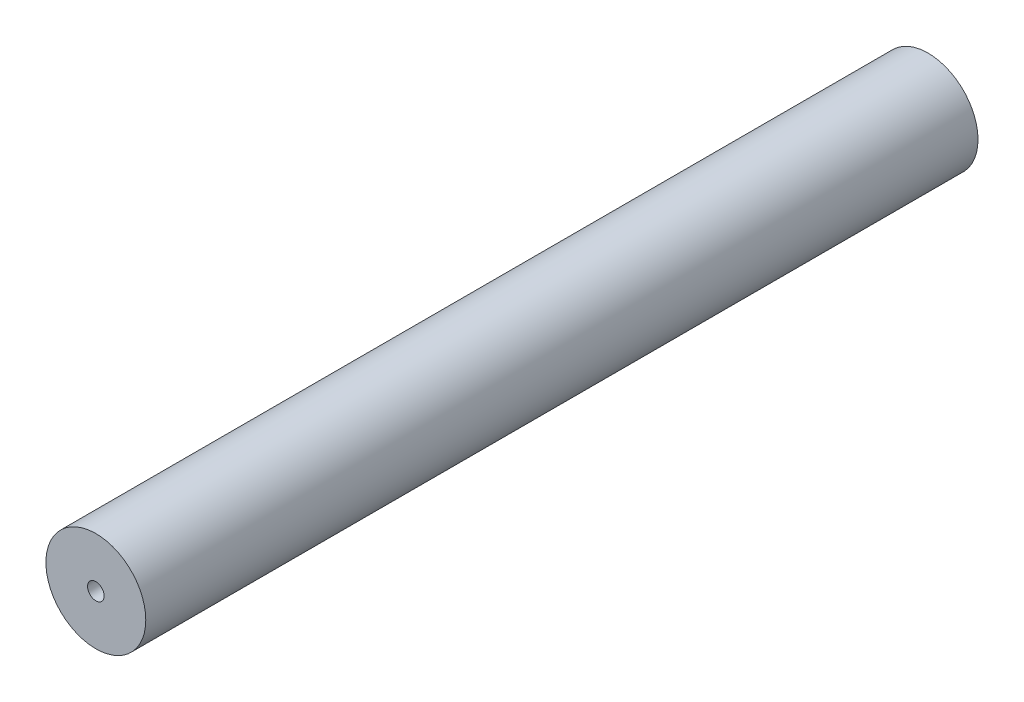
ISO-10303-21;
HEADER;
FILE_DESCRIPTION(('STEP AP214'),'2;1');
FILE_NAME('part.step','',(''),(''),'','','');
FILE_SCHEMA(('AUTOMOTIVE_DESIGN { 1 0 10303 214 1 1 1 1 }'));
ENDSEC;
DATA;
#1=APPLICATION_CONTEXT('core data for automotive mechanical design processes');
#2=APPLICATION_PROTOCOL_DEFINITION('international standard','automotive_design',2000,#1);
#3=PRODUCT_CONTEXT('',#1,'mechanical');
#4=PRODUCT('Part','Part','',(#3));
#5=PRODUCT_RELATED_PRODUCT_CATEGORY('part','',(#4));
#6=PRODUCT_DEFINITION_FORMATION('','',#4);
#7=PRODUCT_DEFINITION_CONTEXT('part definition',#1,'design');
#8=PRODUCT_DEFINITION('design','',#6,#7);
#9=PRODUCT_DEFINITION_SHAPE('','',#8);
#10=(LENGTH_UNIT() NAMED_UNIT(*) SI_UNIT(.MILLI.,.METRE.));
#11=(NAMED_UNIT(*) PLANE_ANGLE_UNIT() SI_UNIT($,.RADIAN.));
#12=(NAMED_UNIT(*) SI_UNIT($,.STERADIAN.) SOLID_ANGLE_UNIT());
#13=UNCERTAINTY_MEASURE_WITH_UNIT(LENGTH_MEASURE(1.E-05),#10,'distance_accuracy_value','');
#14=(GEOMETRIC_REPRESENTATION_CONTEXT(3) GLOBAL_UNCERTAINTY_ASSIGNED_CONTEXT((#13)) GLOBAL_UNIT_ASSIGNED_CONTEXT((#10,
#11,#12)) REPRESENTATION_CONTEXT('',''));
#15=CARTESIAN_POINT('',(0.,0.,0.));
#16=DIRECTION('',(0.,0.,1.));
#17=DIRECTION('',(1.,0.,0.));
#18=AXIS2_PLACEMENT_3D('',#15,#16,#17);
#19=CARTESIAN_POINT('',(0.,0.,500.));
#20=DIRECTION('',(0.,0.,1.));
#21=DIRECTION('',(1.,0.,0.));
#22=AXIS2_PLACEMENT_3D('',#19,#20,#21);
#23=PLANE('',#22);
#24=CARTESIAN_POINT('',(0.,0.,500.));
#25=DIRECTION('',(0.,0.,1.));
#26=DIRECTION('',(1.,0.,0.));
#27=AXIS2_PLACEMENT_3D('',#24,#25,#26);
#28=CIRCLE('',#27,30.);
#29=CARTESIAN_POINT('',(30.,0.,500.));
#30=VERTEX_POINT('',#29);
#31=EDGE_CURVE('E10',#30,#30,#28,.T.);
#32=ORIENTED_EDGE('',*,*,#31,.T.);
#33=EDGE_LOOP('',(#32));
#34=FACE_BOUND('',#33,.T.);
#35=CARTESIAN_POINT('',(0.,0.,500.));
#36=DIRECTION('',(0.,0.,1.));
#37=DIRECTION('',(1.,0.,0.));
#38=AXIS2_PLACEMENT_3D('',#35,#36,#37);
#39=CIRCLE('',#38,5.);
#40=CARTESIAN_POINT('',(5.,0.,500.));
#41=VERTEX_POINT('',#40);
#42=EDGE_CURVE('E47',#41,#41,#39,.T.);
#43=ORIENTED_EDGE('',*,*,#42,.F.);
#44=EDGE_LOOP('',(#43));
#45=FACE_BOUND('',#44,.T.);
#46=ADVANCED_FACE('F36',(#34,#45),#23,.T.);
#47=CARTESIAN_POINT('',(0.,0.,0.));
#48=DIRECTION('',(0.,0.,1.));
#49=DIRECTION('',(1.,0.,0.));
#50=AXIS2_PLACEMENT_3D('',#47,#48,#49);
#51=PLANE('',#50);
#52=CARTESIAN_POINT('',(0.,0.,0.));
#53=DIRECTION('',(0.,0.,1.));
#54=DIRECTION('',(1.,0.,0.));
#55=AXIS2_PLACEMENT_3D('',#52,#53,#54);
#56=CIRCLE('',#55,30.);
#57=CARTESIAN_POINT('',(30.,0.,0.));
#58=VERTEX_POINT('',#57);
#59=EDGE_CURVE('E40',#58,#58,#56,.T.);
#60=ORIENTED_EDGE('',*,*,#59,.F.);
#61=EDGE_LOOP('',(#60));
#62=FACE_BOUND('',#61,.T.);
#63=CARTESIAN_POINT('',(0.,0.,0.));
#64=DIRECTION('',(0.,0.,1.));
#65=DIRECTION('',(1.,0.,0.));
#66=AXIS2_PLACEMENT_3D('',#63,#64,#65);
#67=CIRCLE('',#66,5.);
#68=CARTESIAN_POINT('',(5.,0.,0.));
#69=VERTEX_POINT('',#68);
#70=EDGE_CURVE('E49',#69,#69,#67,.T.);
#71=ORIENTED_EDGE('',*,*,#70,.T.);
#72=EDGE_LOOP('',(#71));
#73=FACE_BOUND('',#72,.T.);
#74=ADVANCED_FACE('F59',(#62,#73),#51,.F.);
#75=CARTESIAN_POINT('',(0.,0.,500.));
#76=DIRECTION('',(0.,0.,-1.));
#77=DIRECTION('',(-1.,0.,0.));
#78=AXIS2_PLACEMENT_3D('',#75,#76,#77);
#79=CYLINDRICAL_SURFACE('',#78,30.);
#80=ORIENTED_EDGE('',*,*,#31,.F.);
#81=EDGE_LOOP('',(#80));
#82=FACE_BOUND('',#81,.T.);
#83=ORIENTED_EDGE('',*,*,#59,.T.);
#84=EDGE_LOOP('',(#83));
#85=FACE_BOUND('',#84,.T.);
#86=ADVANCED_FACE('F38',(#82,#85),#79,.T.);
#87=CARTESIAN_POINT('',(0.,0.,500.));
#88=DIRECTION('',(0.,0.,-1.));
#89=DIRECTION('',(-1.,0.,0.));
#90=AXIS2_PLACEMENT_3D('',#87,#88,#89);
#91=CYLINDRICAL_SURFACE('',#90,5.);
#92=ORIENTED_EDGE('',*,*,#42,.T.);
#93=EDGE_LOOP('',(#92));
#94=FACE_BOUND('',#93,.T.);
#95=ORIENTED_EDGE('',*,*,#70,.F.);
#96=EDGE_LOOP('',(#95));
#97=FACE_BOUND('',#96,.T.);
#98=ADVANCED_FACE('F55',(#94,#97),#91,.F.);
#99=CLOSED_SHELL('',(#46,#74,#86,#98));
#100=MANIFOLD_SOLID_BREP('B2',#99);
#101=ADVANCED_BREP_SHAPE_REPRESENTATION('',(#18,#100),#14);
#102=SHAPE_DEFINITION_REPRESENTATION(#9,#101);
ENDSEC;
END-ISO-10303-21;
